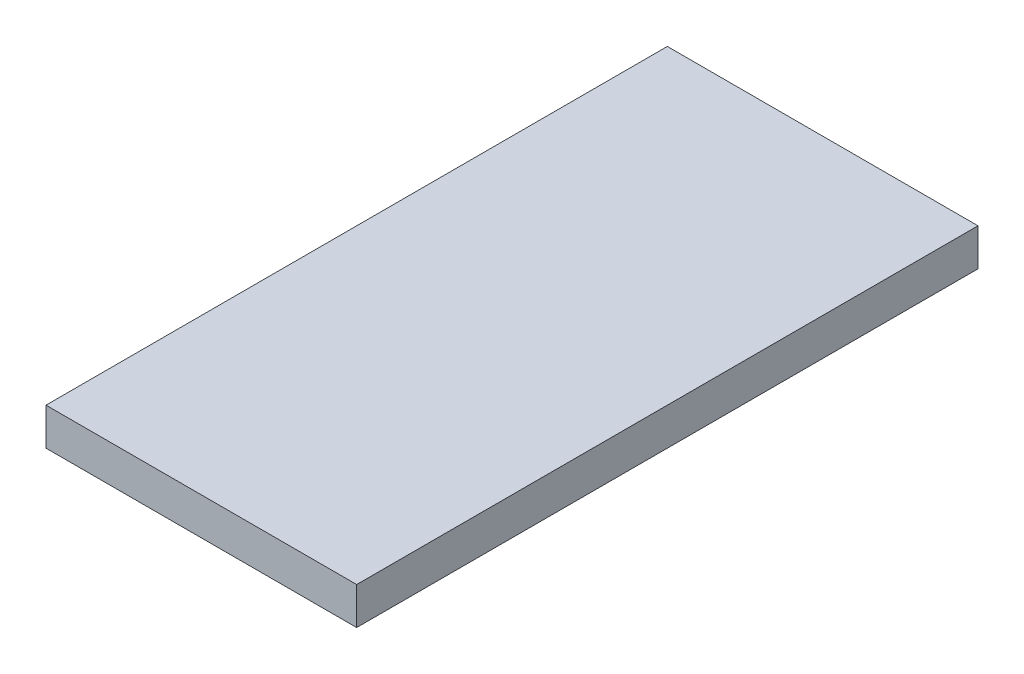
ISO-10303-21;
HEADER;
FILE_DESCRIPTION(('STEP AP214'),'2;1');
FILE_NAME('part.step','',(''),(''),'','','');
FILE_SCHEMA(('AUTOMOTIVE_DESIGN { 1 0 10303 214 1 1 1 1 }'));
ENDSEC;
DATA;
#1=APPLICATION_CONTEXT('core data for automotive mechanical design processes');
#2=APPLICATION_PROTOCOL_DEFINITION('international standard','automotive_design',2000,#1);
#3=PRODUCT_CONTEXT('',#1,'mechanical');
#4=PRODUCT('Part','Part','',(#3));
#5=PRODUCT_RELATED_PRODUCT_CATEGORY('part','',(#4));
#6=PRODUCT_DEFINITION_FORMATION('','',#4);
#7=PRODUCT_DEFINITION_CONTEXT('part definition',#1,'design');
#8=PRODUCT_DEFINITION('design','',#6,#7);
#9=PRODUCT_DEFINITION_SHAPE('','',#8);
#10=(LENGTH_UNIT() NAMED_UNIT(*) SI_UNIT(.MILLI.,.METRE.));
#11=(NAMED_UNIT(*) PLANE_ANGLE_UNIT() SI_UNIT($,.RADIAN.));
#12=(NAMED_UNIT(*) SI_UNIT($,.STERADIAN.) SOLID_ANGLE_UNIT());
#13=UNCERTAINTY_MEASURE_WITH_UNIT(LENGTH_MEASURE(1.E-05),#10,'distance_accuracy_value','');
#14=(GEOMETRIC_REPRESENTATION_CONTEXT(3) GLOBAL_UNCERTAINTY_ASSIGNED_CONTEXT((#13)) GLOBAL_UNIT_ASSIGNED_CONTEXT((#10,
#11,#12)) REPRESENTATION_CONTEXT('',''));
#15=CARTESIAN_POINT('',(0.,0.,0.));
#16=DIRECTION('',(0.,0.,1.));
#17=DIRECTION('',(1.,0.,0.));
#18=AXIS2_PLACEMENT_3D('',#15,#16,#17);
#19=CARTESIAN_POINT('',(-3.9529,3.0056,-3.6790000000001));
#20=DIRECTION('',(1.,0.,0.));
#21=DIRECTION('',(0.,0.,-1.));
#22=AXIS2_PLACEMENT_3D('',#19,#20,#21);
#23=PLANE('',#22);
#24=DIRECTION('',(0.,0.,1.));
#25=VECTOR('',#24,1.);
#26=CARTESIAN_POINT('',(-3.9529,2.9756,-3.6790000000001));
#27=LINE('',#26,#25);
#28=CARTESIAN_POINT('',(-3.9529,2.9756,-3.6790000000001));
#29=VERTEX_POINT('',#28);
#30=CARTESIAN_POINT('',(-3.9529,2.9756,-3.1790000000001));
#31=VERTEX_POINT('',#30);
#32=EDGE_CURVE('E11',#29,#31,#27,.T.);
#33=ORIENTED_EDGE('',*,*,#32,.T.);
#34=DIRECTION('',(0.,-1.,0.));
#35=VECTOR('',#34,1.);
#36=CARTESIAN_POINT('',(-3.9529,3.0056,-3.1790000000001));
#37=LINE('',#36,#35);
#38=CARTESIAN_POINT('',(-3.9529,3.0056,-3.1790000000001));
#39=VERTEX_POINT('',#38);
#40=EDGE_CURVE('E24',#39,#31,#37,.T.);
#41=ORIENTED_EDGE('',*,*,#40,.F.);
#42=DIRECTION('',(0.,0.,1.));
#43=VECTOR('',#42,1.);
#44=CARTESIAN_POINT('',(-3.9529,3.0056,-3.6790000000001));
#45=LINE('',#44,#43);
#46=CARTESIAN_POINT('',(-3.9529,3.0056,-3.6790000000001));
#47=VERTEX_POINT('',#46);
#48=EDGE_CURVE('E88',#47,#39,#45,.T.);
#49=ORIENTED_EDGE('',*,*,#48,.F.);
#50=DIRECTION('',(0.,-1.,0.));
#51=VECTOR('',#50,1.);
#52=CARTESIAN_POINT('',(-3.9529,3.0056,-3.6790000000001));
#53=LINE('',#52,#51);
#54=EDGE_CURVE('E77',#47,#29,#53,.T.);
#55=ORIENTED_EDGE('',*,*,#54,.T.);
#56=EDGE_LOOP('',(#33,#41,#49,#55));
#57=FACE_BOUND('',#56,.T.);
#58=ADVANCED_FACE('F17',(#57),#23,.F.);
#59=CARTESIAN_POINT('',(-3.9529,3.0056,-3.1790000000001));
#60=DIRECTION('',(0.,0.,-1.));
#61=DIRECTION('',(-1.,0.,0.));
#62=AXIS2_PLACEMENT_3D('',#59,#60,#61);
#63=PLANE('',#62);
#64=DIRECTION('',(1.,0.,0.));
#65=VECTOR('',#64,1.);
#66=CARTESIAN_POINT('',(-3.9529,2.9756,-3.1790000000001));
#67=LINE('',#66,#65);
#68=CARTESIAN_POINT('',(-3.7029,2.9756,-3.1790000000001));
#69=VERTEX_POINT('',#68);
#70=EDGE_CURVE('E85',#31,#69,#67,.T.);
#71=ORIENTED_EDGE('',*,*,#70,.T.);
#72=DIRECTION('',(0.,-1.,0.));
#73=VECTOR('',#72,1.);
#74=CARTESIAN_POINT('',(-3.7029,3.0056,-3.1790000000001));
#75=LINE('',#74,#73);
#76=CARTESIAN_POINT('',(-3.7029,3.0056,-3.1790000000001));
#77=VERTEX_POINT('',#76);
#78=EDGE_CURVE('E83',#77,#69,#75,.T.);
#79=ORIENTED_EDGE('',*,*,#78,.F.);
#80=DIRECTION('',(1.,0.,0.));
#81=VECTOR('',#80,1.);
#82=CARTESIAN_POINT('',(-3.9529,3.0056,-3.1790000000001));
#83=LINE('',#82,#81);
#84=EDGE_CURVE('E72',#39,#77,#83,.T.);
#85=ORIENTED_EDGE('',*,*,#84,.F.);
#86=ORIENTED_EDGE('',*,*,#40,.T.);
#87=EDGE_LOOP('',(#71,#79,#85,#86));
#88=FACE_BOUND('',#87,.T.);
#89=ADVANCED_FACE('F90',(#88),#63,.F.);
#90=CARTESIAN_POINT('',(-3.7029,3.0056,-3.6790000000001));
#91=DIRECTION('',(-1.,0.,0.));
#92=DIRECTION('',(0.,0.,1.));
#93=AXIS2_PLACEMENT_3D('',#90,#91,#92);
#94=PLANE('',#93);
#95=DIRECTION('',(0.,0.,-1.));
#96=VECTOR('',#95,1.);
#97=CARTESIAN_POINT('',(-3.7029,2.9756,-3.6790000000001));
#98=LINE('',#97,#96);
#99=CARTESIAN_POINT('',(-3.7029,2.9756,-3.6790000000001));
#100=VERTEX_POINT('',#99);
#101=EDGE_CURVE('E60',#69,#100,#98,.T.);
#102=ORIENTED_EDGE('',*,*,#101,.T.);
#103=DIRECTION('',(0.,-1.,0.));
#104=VECTOR('',#103,1.);
#105=CARTESIAN_POINT('',(-3.7029,3.0056,-3.6790000000001));
#106=LINE('',#105,#104);
#107=CARTESIAN_POINT('',(-3.7029,3.0056,-3.6790000000001));
#108=VERTEX_POINT('',#107);
#109=EDGE_CURVE('E54',#108,#100,#106,.T.);
#110=ORIENTED_EDGE('',*,*,#109,.F.);
#111=DIRECTION('',(0.,0.,-1.));
#112=VECTOR('',#111,1.);
#113=CARTESIAN_POINT('',(-3.7029,3.0056,-3.6790000000001));
#114=LINE('',#113,#112);
#115=EDGE_CURVE('E58',#77,#108,#114,.T.);
#116=ORIENTED_EDGE('',*,*,#115,.F.);
#117=ORIENTED_EDGE('',*,*,#78,.T.);
#118=EDGE_LOOP('',(#102,#110,#116,#117));
#119=FACE_BOUND('',#118,.T.);
#120=ADVANCED_FACE('F56',(#119),#94,.F.);
#121=CARTESIAN_POINT('',(-3.9529,3.0056,-3.6790000000001));
#122=DIRECTION('',(0.,0.,1.));
#123=DIRECTION('',(1.,0.,0.));
#124=AXIS2_PLACEMENT_3D('',#121,#122,#123);
#125=PLANE('',#124);
#126=DIRECTION('',(-1.,0.,0.));
#127=VECTOR('',#126,1.);
#128=CARTESIAN_POINT('',(-3.9529,2.9756,-3.6790000000001));
#129=LINE('',#128,#127);
#130=EDGE_CURVE('E73',#100,#29,#129,.T.);
#131=ORIENTED_EDGE('',*,*,#130,.T.);
#132=ORIENTED_EDGE('',*,*,#54,.F.);
#133=DIRECTION('',(-1.,0.,0.));
#134=VECTOR('',#133,1.);
#135=CARTESIAN_POINT('',(-3.9529,3.0056,-3.6790000000001));
#136=LINE('',#135,#134);
#137=EDGE_CURVE('E70',#108,#47,#136,.T.);
#138=ORIENTED_EDGE('',*,*,#137,.F.);
#139=ORIENTED_EDGE('',*,*,#109,.T.);
#140=EDGE_LOOP('',(#131,#132,#138,#139));
#141=FACE_BOUND('',#140,.T.);
#142=ADVANCED_FACE('F76',(#141),#125,.F.);
#143=CARTESIAN_POINT('',(-4.1529,3.0056,-3.4290000000001));
#144=DIRECTION('',(0.,1.,0.));
#145=DIRECTION('',(0.,0.,1.));
#146=AXIS2_PLACEMENT_3D('',#143,#144,#145);
#147=PLANE('',#146);
#148=ORIENTED_EDGE('',*,*,#48,.T.);
#149=ORIENTED_EDGE('',*,*,#84,.T.);
#150=ORIENTED_EDGE('',*,*,#115,.T.);
#151=ORIENTED_EDGE('',*,*,#137,.T.);
#152=EDGE_LOOP('',(#148,#149,#150,#151));
#153=FACE_BOUND('',#152,.T.);
#154=ADVANCED_FACE('F69',(#153),#147,.T.);
#155=CARTESIAN_POINT('',(-4.1529,2.9756,-3.4290000000001));
#156=DIRECTION('',(0.,1.,0.));
#157=DIRECTION('',(0.,0.,1.));
#158=AXIS2_PLACEMENT_3D('',#155,#156,#157);
#159=PLANE('',#158);
#160=ORIENTED_EDGE('',*,*,#32,.F.);
#161=ORIENTED_EDGE('',*,*,#130,.F.);
#162=ORIENTED_EDGE('',*,*,#101,.F.);
#163=ORIENTED_EDGE('',*,*,#70,.F.);
#164=EDGE_LOOP('',(#160,#161,#162,#163));
#165=FACE_BOUND('',#164,.T.);
#166=ADVANCED_FACE('F91',(#165),#159,.F.);
#167=CLOSED_SHELL('',(#58,#89,#120,#142,#154,#166));
#168=MANIFOLD_SOLID_BREP('B1',#167);
#169=ADVANCED_BREP_SHAPE_REPRESENTATION('',(#18,#168),#14);
#170=SHAPE_DEFINITION_REPRESENTATION(#9,#169);
ENDSEC;
END-ISO-10303-21;
